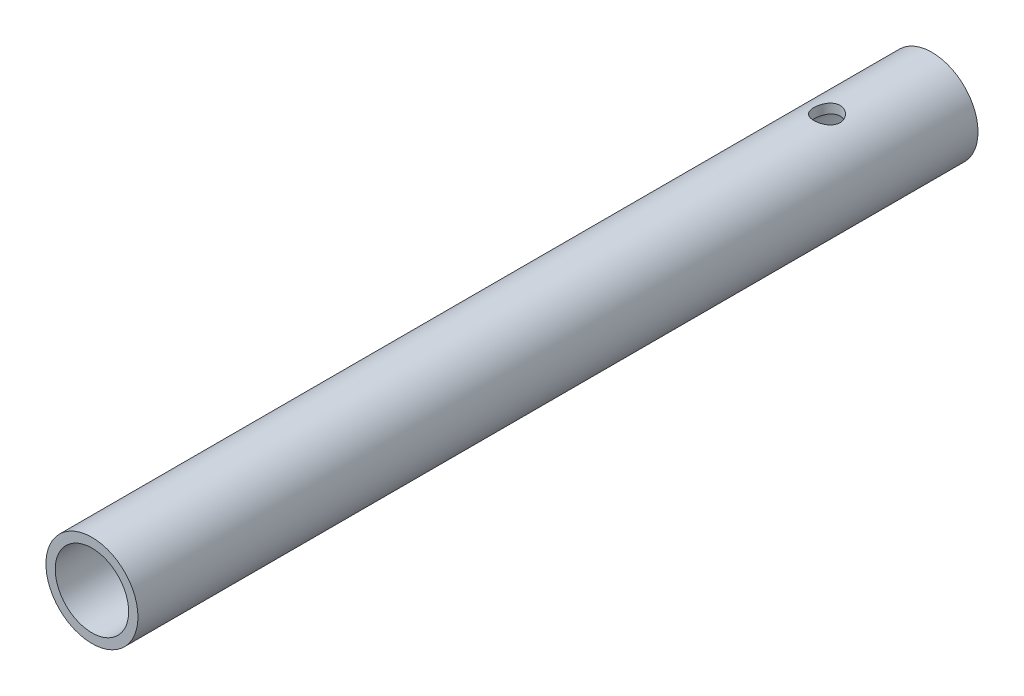
ISO-10303-21;
HEADER;
FILE_DESCRIPTION(('STEP AP214'),'2;1');
FILE_NAME('part.step','',(''),(''),'','','');
FILE_SCHEMA(('AUTOMOTIVE_DESIGN { 1 0 10303 214 1 1 1 1 }'));
ENDSEC;
DATA;
#1=APPLICATION_CONTEXT('core data for automotive mechanical design processes');
#2=APPLICATION_PROTOCOL_DEFINITION('international standard','automotive_design',2000,#1);
#3=PRODUCT_CONTEXT('',#1,'mechanical');
#4=PRODUCT('Part','Part','',(#3));
#5=PRODUCT_RELATED_PRODUCT_CATEGORY('part','',(#4));
#6=PRODUCT_DEFINITION_FORMATION('','',#4);
#7=PRODUCT_DEFINITION_CONTEXT('part definition',#1,'design');
#8=PRODUCT_DEFINITION('design','',#6,#7);
#9=PRODUCT_DEFINITION_SHAPE('','',#8);
#10=(LENGTH_UNIT() NAMED_UNIT(*) SI_UNIT(.MILLI.,.METRE.));
#11=(NAMED_UNIT(*) PLANE_ANGLE_UNIT() SI_UNIT($,.RADIAN.));
#12=(NAMED_UNIT(*) SI_UNIT($,.STERADIAN.) SOLID_ANGLE_UNIT());
#13=UNCERTAINTY_MEASURE_WITH_UNIT(LENGTH_MEASURE(1.E-05),#10,'distance_accuracy_value','');
#14=(GEOMETRIC_REPRESENTATION_CONTEXT(3) GLOBAL_UNCERTAINTY_ASSIGNED_CONTEXT((#13)) GLOBAL_UNIT_ASSIGNED_CONTEXT((#10,
#11,#12)) REPRESENTATION_CONTEXT('',''));
#15=CARTESIAN_POINT('',(0.,0.,0.));
#16=DIRECTION('',(0.,0.,1.));
#17=DIRECTION('',(1.,0.,0.));
#18=AXIS2_PLACEMENT_3D('',#15,#16,#17);
#19=CARTESIAN_POINT('',(0.,0.,152.4));
#20=DIRECTION('',(0.,0.,1.));
#21=DIRECTION('',(1.,0.,0.));
#22=AXIS2_PLACEMENT_3D('',#19,#20,#21);
#23=PLANE('',#22);
#24=CARTESIAN_POINT('',(0.,0.,152.4));
#25=DIRECTION('',(0.,0.,1.));
#26=DIRECTION('',(1.,0.,0.));
#27=AXIS2_PLACEMENT_3D('',#24,#25,#26);
#28=CIRCLE('',#27,16.7005);
#29=CARTESIAN_POINT('',(16.7005,0.,152.4));
#30=VERTEX_POINT('',#29);
#31=EDGE_CURVE('E10',#30,#30,#28,.T.);
#32=ORIENTED_EDGE('',*,*,#31,.T.);
#33=EDGE_LOOP('',(#32));
#34=FACE_BOUND('',#33,.T.);
#35=CARTESIAN_POINT('',(0.,0.,152.4));
#36=DIRECTION('',(0.,0.,1.));
#37=DIRECTION('',(1.,0.,0.));
#38=AXIS2_PLACEMENT_3D('',#35,#36,#37);
#39=CIRCLE('',#38,13.3223);
#40=CARTESIAN_POINT('',(13.3223,0.,152.4));
#41=VERTEX_POINT('',#40);
#42=EDGE_CURVE('E58',#41,#41,#39,.T.);
#43=ORIENTED_EDGE('',*,*,#42,.F.);
#44=EDGE_LOOP('',(#43));
#45=FACE_BOUND('',#44,.T.);
#46=ADVANCED_FACE('F37',(#34,#45),#23,.T.);
#47=CARTESIAN_POINT('',(0.,0.,-152.4));
#48=DIRECTION('',(0.,0.,1.));
#49=DIRECTION('',(1.,0.,0.));
#50=AXIS2_PLACEMENT_3D('',#47,#48,#49);
#51=PLANE('',#50);
#52=CARTESIAN_POINT('',(0.,0.,-152.4));
#53=DIRECTION('',(0.,0.,1.));
#54=DIRECTION('',(1.,0.,0.));
#55=AXIS2_PLACEMENT_3D('',#52,#53,#54);
#56=CIRCLE('',#55,16.7005);
#57=CARTESIAN_POINT('',(16.7005,0.,-152.4));
#58=VERTEX_POINT('',#57);
#59=EDGE_CURVE('E52',#58,#58,#56,.T.);
#60=ORIENTED_EDGE('',*,*,#59,.F.);
#61=EDGE_LOOP('',(#60));
#62=FACE_BOUND('',#61,.T.);
#63=CARTESIAN_POINT('',(0.,0.,-152.4));
#64=DIRECTION('',(0.,0.,1.));
#65=DIRECTION('',(1.,0.,0.));
#66=AXIS2_PLACEMENT_3D('',#63,#64,#65);
#67=CIRCLE('',#66,13.3223);
#68=CARTESIAN_POINT('',(13.3223,0.,-152.4));
#69=VERTEX_POINT('',#68);
#70=EDGE_CURVE('E61',#69,#69,#67,.T.);
#71=ORIENTED_EDGE('',*,*,#70,.T.);
#72=EDGE_LOOP('',(#71));
#73=FACE_BOUND('',#72,.T.);
#74=ADVANCED_FACE('F102',(#62,#73),#51,.F.);
#75=CARTESIAN_POINT('',(0.,0.,152.4));
#76=DIRECTION('',(0.,0.,-1.));
#77=DIRECTION('',(-1.,0.,0.));
#78=AXIS2_PLACEMENT_3D('',#75,#76,#77);
#79=CYLINDRICAL_SURFACE('',#78,16.7005);
#80=CARTESIAN_POINT('',(0.,-16.7005,-109.5375));
#81=CARTESIAN_POINT('',(0.261851066864258,-16.7004968587999,-109.537504669451));
#82=CARTESIAN_POINT('',(0.523750194040546,-16.6942818826769,-109.559167591413));
#83=CARTESIAN_POINT('',(1.03995906137509,-16.6700945455463,-109.645065361519));
#84=CARTESIAN_POINT('',(1.29426586807618,-16.6521177000182,-109.709316447637));
#85=CARTESIAN_POINT('',(1.78776754299851,-16.6063830335173,-109.878098176376));
#86=CARTESIAN_POINT('',(2.02698289826679,-16.5786388242701,-109.98257278267));
#87=CARTESIAN_POINT('',(2.484499437134,-16.5162751075854,-110.228616089177));
#88=CARTESIAN_POINT('',(2.70279845203344,-16.4816548883537,-110.370188630198));
#89=CARTESIAN_POINT('',(3.11800489491059,-16.4082383294875,-110.690321294058));
#90=CARTESIAN_POINT('',(3.31428654304814,-16.3693627672756,-110.869674856312));
#91=CARTESIAN_POINT('',(3.67443335557909,-16.2923058246313,-111.258585100789));
#92=CARTESIAN_POINT('',(3.83829368054584,-16.2541245486039,-111.468146283947));
#93=CARTESIAN_POINT('',(4.13212761208604,-16.1819540877822,-111.916680022377));
#94=CARTESIAN_POINT('',(4.26135761957093,-16.148064062663,-112.156157147302));
#95=CARTESIAN_POINT('',(4.47746373170107,-16.0894886123144,-112.654565031279));
#96=CARTESIAN_POINT('',(4.56434890892751,-16.0648012156447,-112.91349160946));
#97=CARTESIAN_POINT('',(4.69108050769783,-16.0282483121309,-113.43646394113));
#98=CARTESIAN_POINT('',(4.73207207374402,-16.0160713157122,-113.700209861798));
#99=CARTESIAN_POINT('',(4.76942629844259,-16.0049894048341,-114.231094619188));
#100=CARTESIAN_POINT('',(4.76579861364979,-16.0060816186347,-114.498232709272));
#101=CARTESIAN_POINT('',(4.71492117230756,-16.0211373963528,-115.019181547355));
#102=CARTESIAN_POINT('',(4.66908311676671,-16.034684393878,-115.273144162317));
#103=CARTESIAN_POINT('',(4.53735785275083,-16.0724525956833,-115.769614458079));
#104=CARTESIAN_POINT('',(4.4514670360329,-16.0966747616491,-116.012121104673));
#105=CARTESIAN_POINT('',(4.24098459970245,-16.1534118396287,-116.482351947684));
#106=CARTESIAN_POINT('',(4.11591830053792,-16.1860275388587,-116.709850992784));
#107=CARTESIAN_POINT('',(3.83096546767845,-16.2558256659924,-117.141116859733));
#108=CARTESIAN_POINT('',(3.6710712081389,-16.2930091063533,-117.344878400503));
#109=CARTESIAN_POINT('',(3.31389505645754,-16.3694630469047,-117.730919927017));
#110=CARTESIAN_POINT('',(3.11543505416256,-16.4087594970057,-117.912106474797));
#111=CARTESIAN_POINT('',(2.69046043751453,-16.4837682036742,-118.238867140561));
#112=CARTESIAN_POINT('',(2.46394438111898,-16.5194802758387,-118.384439426876));
#113=CARTESIAN_POINT('',(1.9874356690412,-16.5835712082356,-118.636418166407));
#114=CARTESIAN_POINT('',(1.73731961987351,-16.6119082412349,-118.742602618133));
#115=CARTESIAN_POINT('',(1.22178820758726,-16.6577548459264,-118.911087562533));
#116=CARTESIAN_POINT('',(0.956376703672368,-16.6752671358523,-118.97339907282));
#117=CARTESIAN_POINT('',(0.427100363082227,-16.6970697444338,-119.050596602478));
#118=CARTESIAN_POINT('',(0.163468681210381,-16.7017736415647,-119.066966611524));
#119=CARTESIAN_POINT('',(-0.362782020546788,-16.6986316733168,-119.055947816152));
#120=CARTESIAN_POINT('',(-0.625401157680415,-16.6907873075665,-119.028564240674));
#121=CARTESIAN_POINT('',(-1.13671046332572,-16.6636994629912,-118.932024112423));
#122=CARTESIAN_POINT('',(-1.3855743755721,-16.6446878329108,-118.863716639744));
#123=CARTESIAN_POINT('',(-1.86827071984482,-16.5974434633317,-118.688272921255));
#124=CARTESIAN_POINT('',(-2.10210141270511,-16.5692096592254,-118.581132192377));
#125=CARTESIAN_POINT('',(-2.55369492229686,-16.5057111617355,-118.328453616335));
#126=CARTESIAN_POINT('',(-2.77100183278505,-16.4703078307465,-118.182136709282));
#127=CARTESIAN_POINT('',(-3.17849132760995,-16.3965498251763,-117.856220377323));
#128=CARTESIAN_POINT('',(-3.36866774802171,-16.358194482949,-117.676613410311));
#129=CARTESIAN_POINT('',(-3.72290658808979,-16.2812971161416,-117.282259873408));
#130=CARTESIAN_POINT('',(-3.88591652517519,-16.2427897114313,-117.066559207075));
#131=CARTESIAN_POINT('',(-4.17347667245696,-16.1712964596139,-116.610034758073));
#132=CARTESIAN_POINT('',(-4.29802823091364,-16.1383104189592,-116.369211856527));
#133=CARTESIAN_POINT('',(-4.5042264953334,-16.0819799623853,-115.870285238541));
#134=CARTESIAN_POINT('',(-4.58610140418978,-16.0585844103618,-115.612281931997));
#135=CARTESIAN_POINT('',(-4.70504863839723,-16.0241419675628,-115.08537292872));
#136=CARTESIAN_POINT('',(-4.7421344750013,-16.0130913528389,-114.816470545157));
#137=CARTESIAN_POINT('',(-4.76959478743295,-16.0049318418651,-114.286255294797));
#138=CARTESIAN_POINT('',(-4.76167339081926,-16.0073142969749,-114.025037286253));
#139=CARTESIAN_POINT('',(-4.70335931720767,-16.024544169828,-113.507825967019));
#140=CARTESIAN_POINT('',(-4.65296804735032,-16.0393911745874,-113.251832483515));
#141=CARTESIAN_POINT('',(-4.51219538927524,-16.0795531125714,-112.754827868809));
#142=CARTESIAN_POINT('',(-4.42222391359401,-16.1047605762253,-112.513691321255));
#143=CARTESIAN_POINT('',(-4.2051618774969,-16.162793025589,-112.049745856025));
#144=CARTESIAN_POINT('',(-4.07806476855709,-16.195619354967,-111.826940180593));
#145=CARTESIAN_POINT('',(-3.78540069676853,-16.2665545086903,-111.397968382483));
#146=CARTESIAN_POINT('',(-3.61869450490773,-16.3048027484626,-111.192602500565));
#147=CARTESIAN_POINT('',(-3.2536479272947,-16.3815508331911,-110.812207244124));
#148=CARTESIAN_POINT('',(-3.05529959559921,-16.4200507390104,-110.637185512693));
#149=CARTESIAN_POINT('',(-2.62649521887826,-16.4941412662119,-110.318020351858));
#150=CARTESIAN_POINT('',(-2.39534885378574,-16.529632544499,-110.174779121722));
#151=CARTESIAN_POINT('',(-1.9112434928618,-16.5925664100406,-109.929404999612));
#152=CARTESIAN_POINT('',(-1.65829657197492,-16.6200134162703,-109.827249526395));
#153=CARTESIAN_POINT('',(-1.17245500201873,-16.6608343143779,-109.678039720005));
#154=CARTESIAN_POINT('',(-0.941356793742052,-16.6755928418338,-109.625470472473));
#155=CARTESIAN_POINT('',(-0.473518321010904,-16.695426462607,-109.555200813972));
#156=CARTESIAN_POINT('',(-0.236778809193571,-16.70050284043,-109.53749577765));
#157=CARTESIAN_POINT('',(0.,-16.7005,-109.5375));
#158=B_SPLINE_CURVE_WITH_KNOTS('',3,(#80,#81,#82,#83,#84,#85,#86,#87,#88,#89,#90,#91,#92,#93,
#94,#95,#96,#97,#98,#99,#100,#101,#102,#103,#104,#105,#106,#107,#108,#109,#110,#111,#112,#113,
#114,#115,#116,#117,#118,#119,#120,#121,#122,#123,#124,#125,#126,#127,#128,#129,#130,#131,#132,
#133,#134,#135,#136,#137,#138,#139,#140,#141,#142,#143,#144,#145,#146,#147,#148,#149,#150,#151,
#152,#153,#154,#155,#156,#157),.UNSPECIFIED.,.T.,.F.,(4,2,2,2,2,2,2,2,2,2,2,2,2,2,2,2,2,2,2,2,2,
2,2,2,2,2,2,2,2,2,2,2,2,2,2,2,2,2,4),(0.,0.784684112948681,1.56966758174014,2.35356140576426,
3.13753641964346,3.93999727705401,4.7425778250018,5.56121634603525,6.37967939268171,
7.17723026359318,7.97460853057191,8.74625105450002,9.51796310701064,10.2994132101758,
11.0810368383388,11.8919998358795,12.703004533111,13.5185132321812,14.3338170631308,
15.1224641225005,15.911016938612,16.6837496393228,17.4565715758185,18.2460789074958,
19.0357653269846,19.8511761296792,20.6665583427419,21.4775345760985,22.288266105923,
23.0685102380001,23.8487285195174,24.6210500075374,25.3935078063076,26.191665787193,
26.9900245171572,27.8087613429932,28.6270475639417,29.3366922723599,30.0462428274983),.UNSPECIFIED.);
#159=CARTESIAN_POINT('',(0.,-16.7005,-109.5375));
#160=VERTEX_POINT('',#159);
#161=EDGE_CURVE('E88',#160,#160,#158,.T.);
#162=ORIENTED_EDGE('',*,*,#161,.T.);
#163=EDGE_LOOP('',(#162));
#164=FACE_BOUND('',#163,.T.);
#165=CARTESIAN_POINT('',(0.,16.7005,-109.5375));
#166=CARTESIAN_POINT('',(-0.261851066864258,16.7004968587999,-109.537504669451));
#167=CARTESIAN_POINT('',(-0.523750194040546,16.6942818826769,-109.559167591413));
#168=CARTESIAN_POINT('',(-1.03995906137509,16.6700945455463,-109.645065361519));
#169=CARTESIAN_POINT('',(-1.29426586807618,16.6521177000182,-109.709316447637));
#170=CARTESIAN_POINT('',(-1.78776754299851,16.6063830335173,-109.878098176376));
#171=CARTESIAN_POINT('',(-2.02698289826679,16.5786388242701,-109.98257278267));
#172=CARTESIAN_POINT('',(-2.484499437134,16.5162751075854,-110.228616089177));
#173=CARTESIAN_POINT('',(-2.70279845203344,16.4816548883537,-110.370188630198));
#174=CARTESIAN_POINT('',(-3.11800489491059,16.4082383294875,-110.690321294058));
#175=CARTESIAN_POINT('',(-3.31428654304814,16.3693627672756,-110.869674856312));
#176=CARTESIAN_POINT('',(-3.67443335557909,16.2923058246313,-111.258585100789));
#177=CARTESIAN_POINT('',(-3.83829368054584,16.2541245486039,-111.468146283947));
#178=CARTESIAN_POINT('',(-4.13212761208604,16.1819540877822,-111.916680022377));
#179=CARTESIAN_POINT('',(-4.26135761957093,16.148064062663,-112.156157147302));
#180=CARTESIAN_POINT('',(-4.47746373170107,16.0894886123144,-112.654565031279));
#181=CARTESIAN_POINT('',(-4.56434890892751,16.0648012156447,-112.91349160946));
#182=CARTESIAN_POINT('',(-4.69108050769783,16.0282483121309,-113.43646394113));
#183=CARTESIAN_POINT('',(-4.73207207374402,16.0160713157122,-113.700209861798));
#184=CARTESIAN_POINT('',(-4.76942629844259,16.0049894048341,-114.231094619188));
#185=CARTESIAN_POINT('',(-4.76579861364979,16.0060816186347,-114.498232709272));
#186=CARTESIAN_POINT('',(-4.71492117230756,16.0211373963528,-115.019181547355));
#187=CARTESIAN_POINT('',(-4.66908311676671,16.034684393878,-115.273144162317));
#188=CARTESIAN_POINT('',(-4.53735785275083,16.0724525956833,-115.769614458079));
#189=CARTESIAN_POINT('',(-4.4514670360329,16.0966747616491,-116.012121104673));
#190=CARTESIAN_POINT('',(-4.24098459970245,16.1534118396287,-116.482351947684));
#191=CARTESIAN_POINT('',(-4.11591830053792,16.1860275388587,-116.709850992784));
#192=CARTESIAN_POINT('',(-3.83096546767845,16.2558256659924,-117.141116859733));
#193=CARTESIAN_POINT('',(-3.6710712081389,16.2930091063533,-117.344878400503));
#194=CARTESIAN_POINT('',(-3.31389505645754,16.3694630469047,-117.730919927017));
#195=CARTESIAN_POINT('',(-3.11543505416256,16.4087594970057,-117.912106474797));
#196=CARTESIAN_POINT('',(-2.69046043751453,16.4837682036742,-118.238867140561));
#197=CARTESIAN_POINT('',(-2.46394438111898,16.5194802758387,-118.384439426876));
#198=CARTESIAN_POINT('',(-1.9874356690412,16.5835712082356,-118.636418166407));
#199=CARTESIAN_POINT('',(-1.73731961987351,16.6119082412349,-118.742602618133));
#200=CARTESIAN_POINT('',(-1.22178820758726,16.6577548459264,-118.911087562533));
#201=CARTESIAN_POINT('',(-0.956376703672368,16.6752671358523,-118.97339907282));
#202=CARTESIAN_POINT('',(-0.427100363082227,16.6970697444338,-119.050596602478));
#203=CARTESIAN_POINT('',(-0.163468681210381,16.7017736415647,-119.066966611524));
#204=CARTESIAN_POINT('',(0.362782020546788,16.6986316733168,-119.055947816152));
#205=CARTESIAN_POINT('',(0.625401157680415,16.6907873075665,-119.028564240674));
#206=CARTESIAN_POINT('',(1.13671046332572,16.6636994629912,-118.932024112423));
#207=CARTESIAN_POINT('',(1.3855743755721,16.6446878329108,-118.863716639744));
#208=CARTESIAN_POINT('',(1.86827071984482,16.5974434633317,-118.688272921255));
#209=CARTESIAN_POINT('',(2.10210141270511,16.5692096592254,-118.581132192377));
#210=CARTESIAN_POINT('',(2.55369492229686,16.5057111617355,-118.328453616335));
#211=CARTESIAN_POINT('',(2.77100183278505,16.4703078307465,-118.182136709282));
#212=CARTESIAN_POINT('',(3.17849132760995,16.3965498251763,-117.856220377323));
#213=CARTESIAN_POINT('',(3.36866774802171,16.358194482949,-117.676613410311));
#214=CARTESIAN_POINT('',(3.72290658808979,16.2812971161416,-117.282259873408));
#215=CARTESIAN_POINT('',(3.88591652517519,16.2427897114313,-117.066559207075));
#216=CARTESIAN_POINT('',(4.17347667245696,16.1712964596139,-116.610034758073));
#217=CARTESIAN_POINT('',(4.29802823091364,16.1383104189592,-116.369211856527));
#218=CARTESIAN_POINT('',(4.5042264953334,16.0819799623853,-115.870285238541));
#219=CARTESIAN_POINT('',(4.58610140418978,16.0585844103618,-115.612281931997));
#220=CARTESIAN_POINT('',(4.70504863839723,16.0241419675628,-115.08537292872));
#221=CARTESIAN_POINT('',(4.7421344750013,16.0130913528389,-114.816470545157));
#222=CARTESIAN_POINT('',(4.76959478743295,16.0049318418651,-114.286255294797));
#223=CARTESIAN_POINT('',(4.76167339081926,16.0073142969749,-114.025037286253));
#224=CARTESIAN_POINT('',(4.70335931720767,16.024544169828,-113.507825967019));
#225=CARTESIAN_POINT('',(4.65296804735032,16.0393911745874,-113.251832483515));
#226=CARTESIAN_POINT('',(4.51219538927524,16.0795531125714,-112.754827868809));
#227=CARTESIAN_POINT('',(4.42222391359401,16.1047605762253,-112.513691321255));
#228=CARTESIAN_POINT('',(4.2051618774969,16.162793025589,-112.049745856025));
#229=CARTESIAN_POINT('',(4.07806476855709,16.195619354967,-111.826940180593));
#230=CARTESIAN_POINT('',(3.78540069676853,16.2665545086903,-111.397968382483));
#231=CARTESIAN_POINT('',(3.61869450490773,16.3048027484626,-111.192602500565));
#232=CARTESIAN_POINT('',(3.2536479272947,16.3815508331911,-110.812207244124));
#233=CARTESIAN_POINT('',(3.05529959559921,16.4200507390104,-110.637185512693));
#234=CARTESIAN_POINT('',(2.62649521887826,16.4941412662119,-110.318020351858));
#235=CARTESIAN_POINT('',(2.39534885378574,16.529632544499,-110.174779121722));
#236=CARTESIAN_POINT('',(1.9112434928618,16.5925664100406,-109.929404999612));
#237=CARTESIAN_POINT('',(1.65829657197492,16.6200134162703,-109.827249526395));
#238=CARTESIAN_POINT('',(1.17245500201873,16.6608343143779,-109.678039720005));
#239=CARTESIAN_POINT('',(0.941356793742052,16.6755928418338,-109.625470472473));
#240=CARTESIAN_POINT('',(0.473518321010904,16.695426462607,-109.555200813972));
#241=CARTESIAN_POINT('',(0.236778809193571,16.70050284043,-109.53749577765));
#242=CARTESIAN_POINT('',(0.,16.7005,-109.5375));
#243=B_SPLINE_CURVE_WITH_KNOTS('',3,(#165,#166,#167,#168,#169,#170,#171,#172,#173,#174,#175,
#176,#177,#178,#179,#180,#181,#182,#183,#184,#185,#186,#187,#188,#189,#190,#191,#192,#193,#194,
#195,#196,#197,#198,#199,#200,#201,#202,#203,#204,#205,#206,#207,#208,#209,#210,#211,#212,#213,
#214,#215,#216,#217,#218,#219,#220,#221,#222,#223,#224,#225,#226,#227,#228,#229,#230,#231,#232,
#233,#234,#235,#236,#237,#238,#239,#240,#241,#242),.UNSPECIFIED.,.T.,.F.,(4,2,2,2,2,2,2,2,2,2,2,
2,2,2,2,2,2,2,2,2,2,2,2,2,2,2,2,2,2,2,2,2,2,2,2,2,2,2,4),(0.,0.784684112948681,1.56966758174014,
2.35356140576426,3.13753641964346,3.93999727705401,4.7425778250018,5.56121634603525,
6.37967939268171,7.17723026359318,7.97460853057191,8.74625105450002,9.51796310701064,
10.2994132101758,11.0810368383388,11.8919998358795,12.703004533111,13.5185132321812,
14.3338170631308,15.1224641225005,15.911016938612,16.6837496393228,17.4565715758185,
18.2460789074958,19.0357653269846,19.8511761296792,20.6665583427419,21.4775345760985,
22.288266105923,23.0685102380001,23.8487285195174,24.6210500075374,25.3935078063076,
26.191665787193,26.9900245171572,27.8087613429932,28.6270475639417,29.3366922723599,
30.0462428274983),.UNSPECIFIED.);
#244=CARTESIAN_POINT('',(0.,16.7005,-109.5375));
#245=VERTEX_POINT('',#244);
#246=EDGE_CURVE('E82',#245,#245,#243,.T.);
#247=ORIENTED_EDGE('',*,*,#246,.T.);
#248=EDGE_LOOP('',(#247));
#249=FACE_BOUND('',#248,.T.);
#250=ORIENTED_EDGE('',*,*,#31,.F.);
#251=EDGE_LOOP('',(#250));
#252=FACE_BOUND('',#251,.T.);
#253=ORIENTED_EDGE('',*,*,#59,.T.);
#254=EDGE_LOOP('',(#253));
#255=FACE_BOUND('',#254,.T.);
#256=ADVANCED_FACE('F39',(#164,#249,#252,#255),#79,.T.);
#257=CARTESIAN_POINT('',(0.,0.,152.4));
#258=DIRECTION('',(0.,0.,-1.));
#259=DIRECTION('',(-1.,0.,0.));
#260=AXIS2_PLACEMENT_3D('',#257,#258,#259);
#261=CYLINDRICAL_SURFACE('',#260,13.3223);
#262=CARTESIAN_POINT('',(0.,-13.3223,-109.5375));
#263=CARTESIAN_POINT('',(0.129350730515938,-13.322300243397,-109.537499660995));
#264=CARTESIAN_POINT('',(0.258696460501115,-13.3204119620705,-109.542773925758));
#265=CARTESIAN_POINT('',(0.516467405969376,-13.3129098386555,-109.563820679898));
#266=CARTESIAN_POINT('',(0.6448922951605,-13.3072947361351,-109.579596721041));
#267=CARTESIAN_POINT('',(0.899775556580223,-13.2924930523825,-109.621487052547));
#268=CARTESIAN_POINT('',(1.02623475763142,-13.2833080213503,-109.647596855683));
#269=CARTESIAN_POINT('',(1.27639402660263,-13.2616088149797,-109.709918322214));
#270=CARTESIAN_POINT('',(1.40009300507459,-13.249093349471,-109.746133900729));
#271=CARTESIAN_POINT('',(1.64357756681572,-13.2210932519869,-109.828252847969));
#272=CARTESIAN_POINT('',(1.76337130678933,-13.2056153439842,-109.87413430098));
#273=CARTESIAN_POINT('',(1.99858479314219,-13.1720721112586,-109.97524793107));
#274=CARTESIAN_POINT('',(2.11400289974136,-13.154005828423,-110.030483572079));
#275=CARTESIAN_POINT('',(2.45257279332757,-13.0965942379668,-110.209601902114));
#276=CARTESIAN_POINT('',(2.66823564493485,-13.0540126109617,-110.346962375865));
#277=CARTESIAN_POINT('',(3.08134768244231,-12.9628485660007,-110.659092223306));
#278=CARTESIAN_POINT('',(3.27788606825518,-12.9141074592993,-110.835010240137));
#279=CARTESIAN_POINT('',(3.63948619846007,-12.816898546946,-111.217044596596));
#280=CARTESIAN_POINT('',(3.80453954158871,-12.7684308175789,-111.42316897042));
#281=CARTESIAN_POINT('',(4.02766769618274,-12.6991313559906,-111.754820414924));
#282=CARTESIAN_POINT('',(4.09893749715702,-12.6762476387662,-111.87125610319));
#283=CARTESIAN_POINT('',(4.23136250269145,-12.6326601029583,-112.110115644299));
#284=CARTESIAN_POINT('',(4.29252173533412,-12.611955417442,-112.232537087089));
#285=CARTESIAN_POINT('',(4.40421989187281,-12.5733854444767,-112.482580665879));
#286=CARTESIAN_POINT('',(4.45475729264168,-12.5555205643335,-112.610203544616));
#287=CARTESIAN_POINT('',(4.54471312986649,-12.5232401960634,-112.869675123864));
#288=CARTESIAN_POINT('',(4.58413679833238,-12.5088230853171,-113.001521803272));
#289=CARTESIAN_POINT('',(4.65022326269924,-12.4844021000019,-113.263473734426));
#290=CARTESIAN_POINT('',(4.6773093986414,-12.4742529192449,-113.393458675081));
#291=CARTESIAN_POINT('',(4.72054562953798,-12.4579557681722,-113.655430150868));
#292=CARTESIAN_POINT('',(4.73670040803317,-12.4518060843158,-113.787415803981));
#293=CARTESIAN_POINT('',(4.75791541644593,-12.4437151897086,-114.05238991446));
#294=CARTESIAN_POINT('',(4.76297690258746,-12.4417735024373,-114.185378256568));
#295=CARTESIAN_POINT('',(4.76195246579,-12.4421656891435,-114.451303176176));
#296=CARTESIAN_POINT('',(4.75586692183525,-12.4444994177626,-114.584239755284));
#297=CARTESIAN_POINT('',(4.73324437616506,-12.4531204846095,-114.841861180851));
#298=CARTESIAN_POINT('',(4.71728786627513,-12.4591881407542,-114.966604872156));
#299=CARTESIAN_POINT('',(4.67560760469911,-12.4748894205744,-115.214261875677));
#300=CARTESIAN_POINT('',(4.64988058973155,-12.4845242356296,-115.337174562079));
#301=CARTESIAN_POINT('',(4.58889931790374,-12.5070674499487,-115.580274643974));
#302=CARTESIAN_POINT('',(4.55364762410673,-12.5199749684804,-115.700462763222));
#303=CARTESIAN_POINT('',(4.47392205406653,-12.5486846459054,-115.937400091566));
#304=CARTESIAN_POINT('',(4.42944465003211,-12.5644879118245,-116.054147965596));
#305=CARTESIAN_POINT('',(4.28096362052221,-12.6161876622691,-116.402134851126));
#306=CARTESIAN_POINT('',(4.16294593080656,-12.6559710636699,-116.627003440079));
#307=CARTESIAN_POINT('',(3.89346586061366,-12.7414488479612,-117.054320613302));
#308=CARTESIAN_POINT('',(3.74199270994864,-12.787145132397,-117.256761946066));
#309=CARTESIAN_POINT('',(3.3990225300915,-12.8826953987448,-117.646550860601));
#310=CARTESIAN_POINT('',(3.20565566225802,-12.9326334820895,-117.83223912407));
#311=CARTESIAN_POINT('',(2.78993599174279,-13.0286374780387,-118.169011157046));
#312=CARTESIAN_POINT('',(2.56757951608161,-13.0747028987587,-118.320090534913));
#313=CARTESIAN_POINT('',(2.09626212291889,-13.1585450435471,-118.58498123236));
#314=CARTESIAN_POINT('',(1.84699489471295,-13.1962071251106,-118.698286424519));
#315=CARTESIAN_POINT('',(1.33126128643145,-13.2581572961857,-118.880817801618));
#316=CARTESIAN_POINT('',(1.06480186749922,-13.2824507611718,-118.950061705205));
#317=CARTESIAN_POINT('',(0.536266189021672,-13.314005100732,-119.039421011495));
#318=CARTESIAN_POINT('',(0.274614639359339,-13.3220420518479,-119.061776901903));
#319=CARTESIAN_POINT('',(-0.248791544331392,-13.3225454350244,-119.063188094349));
#320=CARTESIAN_POINT('',(-0.51054614765918,-13.3150149521512,-119.042251975751));
#321=CARTESIAN_POINT('',(-1.01735773250936,-13.2857423858395,-118.959408082939));
#322=CARTESIAN_POINT('',(-1.26267956379922,-13.2644957550019,-118.898927777461));
#323=CARTESIAN_POINT('',(-1.73955366796628,-13.210422654735,-118.740553437206));
#324=CARTESIAN_POINT('',(-1.97110414828661,-13.177594681651,-118.642654544076));
#325=CARTESIAN_POINT('',(-2.42117744757249,-13.1024854927309,-118.409181771086));
#326=CARTESIAN_POINT('',(-2.63914788270048,-13.0599635494472,-118.272622243269));
#327=CARTESIAN_POINT('',(-3.04975895363681,-12.9702313831047,-117.966878006562));
#328=CARTESIAN_POINT('',(-3.24239084812593,-12.9230195519303,-117.797682088122));
#329=CARTESIAN_POINT('',(-3.60752375423629,-12.826028490505,-117.420811961203));
#330=CARTESIAN_POINT('',(-3.77843324232411,-12.7762448194416,-117.211582086642));
#331=CARTESIAN_POINT('',(-4.00672354202706,-12.7057552356883,-116.877948385758));
#332=CARTESIAN_POINT('',(-4.07817491003337,-12.6829442364463,-116.763366123677));
#333=CARTESIAN_POINT('',(-4.21122984275327,-12.6393873704902,-116.528264069439));
#334=CARTESIAN_POINT('',(-4.27283754830913,-12.6186406368136,-116.407746801964));
#335=CARTESIAN_POINT('',(-4.38579506308812,-12.5798273818709,-116.161347096193));
#336=CARTESIAN_POINT('',(-4.43712823627972,-12.5617652193114,-116.035456350872));
#337=CARTESIAN_POINT('',(-4.52893413088816,-12.5289588593337,-115.779407664143));
#338=CARTESIAN_POINT('',(-4.56941140439637,-12.5142132716307,-115.649251537068));
#339=CARTESIAN_POINT('',(-4.63911785502316,-12.4885405374433,-115.385622972923));
#340=CARTESIAN_POINT('',(-4.66834975340275,-12.4776124672193,-115.252151346502));
#341=CARTESIAN_POINT('',(-4.71526174502259,-12.4599604782178,-114.982920592903));
#342=CARTESIAN_POINT('',(-4.73294254328319,-12.453236302857,-114.847161605852));
#343=CARTESIAN_POINT('',(-4.75585628605772,-12.4445026869162,-114.582529082299));
#344=CARTESIAN_POINT('',(-4.76176198311787,-12.442238530753,-114.45372177199));
#345=CARTESIAN_POINT('',(-4.76310824686383,-12.441723297448,-114.195998476661));
#346=CARTESIAN_POINT('',(-4.75854527246796,-12.4434735782098,-114.067082469617));
#347=CARTESIAN_POINT('',(-4.7389982168454,-12.4509309503096,-113.810219341814));
#348=CARTESIAN_POINT('',(-4.72401887614534,-12.4566362417039,-113.682271807066));
#349=CARTESIAN_POINT('',(-4.68379066196936,-12.4718179594421,-113.428183061451));
#350=CARTESIAN_POINT('',(-4.65853792516311,-12.4812958044331,-113.302042548612));
#351=CARTESIAN_POINT('',(-4.59877982209245,-12.5034350935499,-113.05570318004));
#352=CARTESIAN_POINT('',(-4.56452810551835,-12.5160087451646,-112.935434896797));
#353=CARTESIAN_POINT('',(-4.48680413205207,-12.5440809171326,-112.698252621135));
#354=CARTESIAN_POINT('',(-4.44332862628687,-12.5595804678556,-112.581339827129));
#355=CARTESIAN_POINT('',(-4.29956467893296,-12.6098285384576,-112.236756039018));
#356=CARTESIAN_POINT('',(-4.18589270689911,-12.6483444536434,-112.015051247642));
#357=CARTESIAN_POINT('',(-3.91982730861761,-12.7333822711104,-111.582640620216));
#358=CARTESIAN_POINT('',(-3.76581493822218,-12.7802031483946,-111.372999557292));
#359=CARTESIAN_POINT('',(-3.42585695171425,-12.8754894853158,-110.981563679174));
#360=CARTESIAN_POINT('',(-3.23990167004999,-12.9239554391615,-110.799777324083));
#361=CARTESIAN_POINT('',(-2.93574837547195,-12.9952550432699,-110.547492705599));
#362=CARTESIAN_POINT('',(-2.82740487428935,-13.0193133328222,-110.465195023847));
#363=CARTESIAN_POINT('',(-2.60385761598932,-13.0658567248872,-110.310035792277));
#364=CARTESIAN_POINT('',(-2.48865642075261,-13.0883424081471,-110.237170750532));
#365=CARTESIAN_POINT('',(-2.25207894915534,-13.1311186336235,-110.101409688564));
#366=CARTESIAN_POINT('',(-2.13070032122787,-13.1514083305632,-110.038517502779));
#367=CARTESIAN_POINT('',(-1.88267410748747,-13.1891978671372,-109.923285306735));
#368=CARTESIAN_POINT('',(-1.75602884488528,-13.2066989207732,-109.870940702074));
#369=CARTESIAN_POINT('',(-1.49762759306552,-13.2384977964792,-109.777001136145));
#370=CARTESIAN_POINT('',(-1.36584759821901,-13.2527777194248,-109.735466053994));
#371=CARTESIAN_POINT('',(-1.09889777659129,-13.2775773366837,-109.663954874989));
#372=CARTESIAN_POINT('',(-0.963729414538605,-13.2880986267794,-109.633973872256));
#373=CARTESIAN_POINT('',(-0.691059293129309,-13.3050655984981,-109.585871580246));
#374=CARTESIAN_POINT('',(-0.553557791663836,-13.31151172759,-109.56774898886));
#375=CARTESIAN_POINT('',(-0.277368894654891,-13.3201286650425,-109.543563755133));
#376=CARTESIAN_POINT('',(-0.138681573333452,-13.3222997390453,-109.537500363459));
#377=CARTESIAN_POINT('',(0.,-13.3223,-109.5375));
#378=B_SPLINE_CURVE_WITH_KNOTS('',3,(#262,#263,#264,#265,#266,#267,#268,#269,#270,#271,#272,
#273,#274,#275,#276,#277,#278,#279,#280,#281,#282,#283,#284,#285,#286,#287,#288,#289,#290,#291,
#292,#293,#294,#295,#296,#297,#298,#299,#300,#301,#302,#303,#304,#305,#306,#307,#308,#309,#310,
#311,#312,#313,#314,#315,#316,#317,#318,#319,#320,#321,#322,#323,#324,#325,#326,#327,#328,#329,
#330,#331,#332,#333,#334,#335,#336,#337,#338,#339,#340,#341,#342,#343,#344,#345,#346,#347,#348,
#349,#350,#351,#352,#353,#354,#355,#356,#357,#358,#359,#360,#361,#362,#363,#364,#365,#366,#367,
#368,#369,#370,#371,#372,#373,#374,#375,#376,#377),.UNSPECIFIED.,.T.,.F.,(4,2,2,2,2,2,2,2,2,2,2,
2,2,2,2,2,2,2,2,2,2,2,2,2,2,2,2,2,2,2,2,2,2,2,2,2,2,2,2,2,2,2,2,2,2,2,2,2,2,2,2,2,2,2,2,2,2,4),
(0.,0.387922860761339,0.775976986107835,1.16386279138639,1.55189907826425,1.93906485016833,
2.3263743074126,3.10037724336654,3.90168216543757,4.7032006043116,5.11803694927494,
5.53270762173076,5.94743771575411,6.36197224006306,6.76095128124039,7.15975927140217,
7.55852209751109,7.95727136646462,8.33454677283031,8.71194829756116,9.08924836561789,
9.4666929751511,10.2342147174608,11.001983906168,11.8163031435233,12.6307256554652,
13.4556587354044,14.2802598697713,15.0644663415829,15.8485174186789,16.6057215845295,
17.3630240976081,18.1417076618381,18.9206591566125,19.7405771917999,20.151017021355,
20.5612837378264,20.972209458366,21.3829625993422,21.7936162798139,22.2042448937328,
22.590651332125,22.9771884937414,23.3635498559056,23.7500566445027,24.1266603294895,
24.5033968855648,25.2562924494245,26.0459304113392,26.8358077307247,27.2498916973321,
27.6638219306082,28.0779109310333,28.4918191674286,28.9079736520875,29.3239512417144,
29.7398831474045,30.1557892072142),.UNSPECIFIED.);
#379=CARTESIAN_POINT('',(0.,-13.3223,-109.5375));
#380=VERTEX_POINT('',#379);
#381=EDGE_CURVE('E42',#380,#380,#378,.T.);
#382=ORIENTED_EDGE('',*,*,#381,.F.);
#383=EDGE_LOOP('',(#382));
#384=FACE_BOUND('',#383,.T.);
#385=CARTESIAN_POINT('',(0.,13.3223,-109.5375));
#386=CARTESIAN_POINT('',(-0.129350730515938,13.322300243397,-109.537499660995));
#387=CARTESIAN_POINT('',(-0.258696460501114,13.3204119620705,-109.542773925758));
#388=CARTESIAN_POINT('',(-0.516467405969375,13.3129098386555,-109.563820679898));
#389=CARTESIAN_POINT('',(-0.6448922951605,13.3072947361351,-109.579596721041));
#390=CARTESIAN_POINT('',(-0.899775556580223,13.2924930523825,-109.621487052547));
#391=CARTESIAN_POINT('',(-1.02623475763142,13.2833080213503,-109.647596855683));
#392=CARTESIAN_POINT('',(-1.27639402660263,13.2616088149797,-109.709918322214));
#393=CARTESIAN_POINT('',(-1.40009300507459,13.249093349471,-109.746133900729));
#394=CARTESIAN_POINT('',(-1.64357756681572,13.2210932519869,-109.828252847969));
#395=CARTESIAN_POINT('',(-1.76337130678934,13.2056153439842,-109.87413430098));
#396=CARTESIAN_POINT('',(-1.99858479314219,13.1720721112586,-109.97524793107));
#397=CARTESIAN_POINT('',(-2.11400289974136,13.154005828423,-110.030483572079));
#398=CARTESIAN_POINT('',(-2.45257279332757,13.0965942379668,-110.209601902114));
#399=CARTESIAN_POINT('',(-2.66823564493485,13.0540126109617,-110.346962375865));
#400=CARTESIAN_POINT('',(-3.0813476824423,12.9628485660007,-110.659092223306));
#401=CARTESIAN_POINT('',(-3.27788606825518,12.9141074592993,-110.835010240137));
#402=CARTESIAN_POINT('',(-3.63948619846007,12.816898546946,-111.217044596596));
#403=CARTESIAN_POINT('',(-3.80453954158872,12.7684308175789,-111.42316897042));
#404=CARTESIAN_POINT('',(-4.02766769618273,12.6991313559906,-111.754820414924));
#405=CARTESIAN_POINT('',(-4.09893749715701,12.6762476387662,-111.87125610319));
#406=CARTESIAN_POINT('',(-4.23136250269144,12.6326601029583,-112.110115644299));
#407=CARTESIAN_POINT('',(-4.29252173533411,12.611955417442,-112.232537087089));
#408=CARTESIAN_POINT('',(-4.40421989187281,12.5733854444767,-112.482580665879));
#409=CARTESIAN_POINT('',(-4.45475729264168,12.5555205643335,-112.610203544616));
#410=CARTESIAN_POINT('',(-4.54471312986649,12.5232401960634,-112.869675123864));
#411=CARTESIAN_POINT('',(-4.58413679833238,12.5088230853171,-113.001521803272));
#412=CARTESIAN_POINT('',(-4.65022326269924,12.4844021000019,-113.263473734426));
#413=CARTESIAN_POINT('',(-4.67730939864139,12.4742529192449,-113.393458675081));
#414=CARTESIAN_POINT('',(-4.72054562953798,12.4579557681722,-113.655430150868));
#415=CARTESIAN_POINT('',(-4.73670040803317,12.4518060843158,-113.787415803981));
#416=CARTESIAN_POINT('',(-4.75791541644593,12.4437151897086,-114.05238991446));
#417=CARTESIAN_POINT('',(-4.76297690258746,12.4417735024373,-114.185378256568));
#418=CARTESIAN_POINT('',(-4.76195246579,12.4421656891435,-114.451303176176));
#419=CARTESIAN_POINT('',(-4.75586692183525,12.4444994177626,-114.584239755284));
#420=CARTESIAN_POINT('',(-4.73324437616506,12.4531204846095,-114.841861180851));
#421=CARTESIAN_POINT('',(-4.71728786627513,12.4591881407542,-114.966604872156));
#422=CARTESIAN_POINT('',(-4.67560760469911,12.4748894205744,-115.214261875677));
#423=CARTESIAN_POINT('',(-4.64988058973155,12.4845242356296,-115.337174562079));
#424=CARTESIAN_POINT('',(-4.58889931790374,12.5070674499487,-115.580274643974));
#425=CARTESIAN_POINT('',(-4.55364762410673,12.5199749684804,-115.700462763222));
#426=CARTESIAN_POINT('',(-4.47392205406653,12.5486846459054,-115.937400091566));
#427=CARTESIAN_POINT('',(-4.42944465003211,12.5644879118245,-116.054147965596));
#428=CARTESIAN_POINT('',(-4.28096362052221,12.6161876622691,-116.402134851126));
#429=CARTESIAN_POINT('',(-4.16294593080656,12.6559710636699,-116.627003440079));
#430=CARTESIAN_POINT('',(-3.89346586061366,12.7414488479612,-117.054320613302));
#431=CARTESIAN_POINT('',(-3.74199270994864,12.787145132397,-117.256761946066));
#432=CARTESIAN_POINT('',(-3.3990225300915,12.8826953987448,-117.646550860601));
#433=CARTESIAN_POINT('',(-3.20565566225802,12.9326334820895,-117.83223912407));
#434=CARTESIAN_POINT('',(-2.78993599174279,13.0286374780387,-118.169011157046));
#435=CARTESIAN_POINT('',(-2.56757951608161,13.0747028987587,-118.320090534913));
#436=CARTESIAN_POINT('',(-2.09626212291889,13.1585450435471,-118.58498123236));
#437=CARTESIAN_POINT('',(-1.84699489471294,13.1962071251106,-118.698286424519));
#438=CARTESIAN_POINT('',(-1.33126128643145,13.2581572961857,-118.880817801618));
#439=CARTESIAN_POINT('',(-1.06480186749922,13.2824507611718,-118.950061705205));
#440=CARTESIAN_POINT('',(-0.536266189021671,13.314005100732,-119.039421011495));
#441=CARTESIAN_POINT('',(-0.274614639359338,13.3220420518479,-119.061776901903));
#442=CARTESIAN_POINT('',(0.248791544331393,13.3225454350244,-119.063188094349));
#443=CARTESIAN_POINT('',(0.510546147659181,13.3150149521512,-119.042251975751));
#444=CARTESIAN_POINT('',(1.01735773250936,13.2857423858395,-118.959408082939));
#445=CARTESIAN_POINT('',(1.26267956379922,13.2644957550019,-118.898927777461));
#446=CARTESIAN_POINT('',(1.73955366796628,13.210422654735,-118.740553437206));
#447=CARTESIAN_POINT('',(1.97110414828661,13.177594681651,-118.642654544076));
#448=CARTESIAN_POINT('',(2.42117744757249,13.1024854927309,-118.409181771086));
#449=CARTESIAN_POINT('',(2.63914788270048,13.0599635494472,-118.272622243269));
#450=CARTESIAN_POINT('',(3.04975895363681,12.9702313831047,-117.966878006562));
#451=CARTESIAN_POINT('',(3.24239084812593,12.9230195519303,-117.797682088122));
#452=CARTESIAN_POINT('',(3.60752375423628,12.826028490505,-117.420811961203));
#453=CARTESIAN_POINT('',(3.77843324232411,12.7762448194416,-117.211582086642));
#454=CARTESIAN_POINT('',(4.00672354202704,12.7057552356883,-116.877948385758));
#455=CARTESIAN_POINT('',(4.07817491003335,12.6829442364463,-116.763366123677));
#456=CARTESIAN_POINT('',(4.21122984275326,12.6393873704902,-116.528264069439));
#457=CARTESIAN_POINT('',(4.27283754830912,12.6186406368136,-116.407746801964));
#458=CARTESIAN_POINT('',(4.38579506308812,12.5798273818709,-116.161347096193));
#459=CARTESIAN_POINT('',(4.43712823627973,12.5617652193114,-116.035456350872));
#460=CARTESIAN_POINT('',(4.52893413088817,12.5289588593337,-115.779407664143));
#461=CARTESIAN_POINT('',(4.56941140439637,12.5142132716307,-115.649251537068));
#462=CARTESIAN_POINT('',(4.63911785502316,12.4885405374433,-115.385622972923));
#463=CARTESIAN_POINT('',(4.66834975340275,12.4776124672193,-115.252151346502));
#464=CARTESIAN_POINT('',(4.71526174502259,12.4599604782178,-114.982920592903));
#465=CARTESIAN_POINT('',(4.73294254328319,12.453236302857,-114.847161605852));
#466=CARTESIAN_POINT('',(4.75585628605772,12.4445026869162,-114.582529082299));
#467=CARTESIAN_POINT('',(4.76176198311787,12.442238530753,-114.45372177199));
#468=CARTESIAN_POINT('',(4.76310824686383,12.441723297448,-114.195998476661));
#469=CARTESIAN_POINT('',(4.75854527246796,12.4434735782098,-114.067082469617));
#470=CARTESIAN_POINT('',(4.7389982168454,12.4509309503096,-113.810219341814));
#471=CARTESIAN_POINT('',(4.72401887614534,12.4566362417039,-113.682271807066));
#472=CARTESIAN_POINT('',(4.68379066196936,12.4718179594421,-113.428183061451));
#473=CARTESIAN_POINT('',(4.65853792516311,12.4812958044331,-113.302042548612));
#474=CARTESIAN_POINT('',(4.59877982209245,12.5034350935499,-113.05570318004));
#475=CARTESIAN_POINT('',(4.56452810551835,12.5160087451646,-112.935434896797));
#476=CARTESIAN_POINT('',(4.48680413205207,12.5440809171326,-112.698252621135));
#477=CARTESIAN_POINT('',(4.44332862628687,12.5595804678556,-112.581339827129));
#478=CARTESIAN_POINT('',(4.29956467893296,12.6098285384576,-112.236756039018));
#479=CARTESIAN_POINT('',(4.18589270689911,12.6483444536434,-112.015051247642));
#480=CARTESIAN_POINT('',(3.9198273086176,12.7333822711104,-111.582640620216));
#481=CARTESIAN_POINT('',(3.76581493822217,12.7802031483946,-111.372999557292));
#482=CARTESIAN_POINT('',(3.42585695171424,12.8754894853158,-110.981563679174));
#483=CARTESIAN_POINT('',(3.23990167004998,12.9239554391615,-110.799777324083));
#484=CARTESIAN_POINT('',(2.93574837547194,12.9952550432699,-110.547492705599));
#485=CARTESIAN_POINT('',(2.82740487428934,13.0193133328222,-110.465195023847));
#486=CARTESIAN_POINT('',(2.60385761598931,13.0658567248872,-110.310035792277));
#487=CARTESIAN_POINT('',(2.4886564207526,13.0883424081471,-110.237170750532));
#488=CARTESIAN_POINT('',(2.25207894915534,13.1311186336235,-110.101409688564));
#489=CARTESIAN_POINT('',(2.13070032122786,13.1514083305632,-110.038517502779));
#490=CARTESIAN_POINT('',(1.88267410748747,13.1891978671372,-109.923285306735));
#491=CARTESIAN_POINT('',(1.75602884488528,13.2066989207732,-109.870940702074));
#492=CARTESIAN_POINT('',(1.49762759306553,13.2384977964792,-109.777001136145));
#493=CARTESIAN_POINT('',(1.36584759821902,13.2527777194248,-109.735466053994));
#494=CARTESIAN_POINT('',(1.09889777659129,13.2775773366837,-109.663954874989));
#495=CARTESIAN_POINT('',(0.963729414538611,13.2880986267794,-109.633973872256));
#496=CARTESIAN_POINT('',(0.691059293129314,13.3050655984981,-109.585871580246));
#497=CARTESIAN_POINT('',(0.553557791663839,13.31151172759,-109.56774898886));
#498=CARTESIAN_POINT('',(0.277368894654892,13.3201286650425,-109.543563755133));
#499=CARTESIAN_POINT('',(0.138681573333452,13.3222997390453,-109.537500363459));
#500=CARTESIAN_POINT('',(0.,13.3223,-109.5375));
#501=B_SPLINE_CURVE_WITH_KNOTS('',3,(#385,#386,#387,#388,#389,#390,#391,#392,#393,#394,#395,
#396,#397,#398,#399,#400,#401,#402,#403,#404,#405,#406,#407,#408,#409,#410,#411,#412,#413,#414,
#415,#416,#417,#418,#419,#420,#421,#422,#423,#424,#425,#426,#427,#428,#429,#430,#431,#432,#433,
#434,#435,#436,#437,#438,#439,#440,#441,#442,#443,#444,#445,#446,#447,#448,#449,#450,#451,#452,
#453,#454,#455,#456,#457,#458,#459,#460,#461,#462,#463,#464,#465,#466,#467,#468,#469,#470,#471,
#472,#473,#474,#475,#476,#477,#478,#479,#480,#481,#482,#483,#484,#485,#486,#487,#488,#489,#490,
#491,#492,#493,#494,#495,#496,#497,#498,#499,#500),.UNSPECIFIED.,.T.,.F.,(4,2,2,2,2,2,2,2,2,2,2,
2,2,2,2,2,2,2,2,2,2,2,2,2,2,2,2,2,2,2,2,2,2,2,2,2,2,2,2,2,2,2,2,2,2,2,2,2,2,2,2,2,2,2,2,2,2,4),
(0.,0.387922860761339,0.775976986107834,1.16386279138639,1.55189907826425,1.93906485016833,
2.3263743074126,3.10037724336654,3.90168216543757,4.70320060431159,5.11803694927492,
5.53270762173075,5.94743771575411,6.36197224006304,6.76095128124038,7.15975927140217,
7.55852209751109,7.95727136646462,8.33454677283031,8.71194829756114,9.08924836561789,
9.4666929751511,10.2342147174608,11.001983906168,11.8163031435233,12.6307256554652,
13.4556587354044,14.2802598697713,15.0644663415829,15.8485174186789,16.6057215845295,
17.3630240976081,18.1417076618381,18.9206591566125,19.7405771917999,20.151017021355,
20.5612837378264,20.9722094583661,21.3829625993423,21.7936162798139,22.2042448937328,
22.590651332125,22.9771884937414,23.3635498559056,23.7500566445027,24.1266603294895,
24.5033968855648,25.2562924494245,26.0459304113392,26.8358077307247,27.2498916973321,
27.6638219306082,28.0779109310333,28.4918191674286,28.9079736520875,29.3239512417144,
29.7398831474045,30.1557892072142),.UNSPECIFIED.);
#502=CARTESIAN_POINT('',(0.,13.3223,-109.5375));
#503=VERTEX_POINT('',#502);
#504=EDGE_CURVE('E63',#503,#503,#501,.T.);
#505=ORIENTED_EDGE('',*,*,#504,.F.);
#506=EDGE_LOOP('',(#505));
#507=FACE_BOUND('',#506,.T.);
#508=ORIENTED_EDGE('',*,*,#42,.T.);
#509=EDGE_LOOP('',(#508));
#510=FACE_BOUND('',#509,.T.);
#511=ORIENTED_EDGE('',*,*,#70,.F.);
#512=EDGE_LOOP('',(#511));
#513=FACE_BOUND('',#512,.T.);
#514=ADVANCED_FACE('F69',(#384,#507,#510,#513),#261,.F.);
#515=CARTESIAN_POINT('',(0.,-16.7005,-114.3));
#516=DIRECTION('',(0.,1.,0.));
#517=DIRECTION('',(0.,0.,1.));
#518=AXIS2_PLACEMENT_3D('',#515,#516,#517);
#519=CYLINDRICAL_SURFACE('',#518,4.7625);
#520=ORIENTED_EDGE('',*,*,#504,.T.);
#521=EDGE_LOOP('',(#520));
#522=FACE_BOUND('',#521,.T.);
#523=ORIENTED_EDGE('',*,*,#246,.F.);
#524=EDGE_LOOP('',(#523));
#525=FACE_BOUND('',#524,.T.);
#526=ADVANCED_FACE('F75',(#522,#525),#519,.F.);
#527=ORIENTED_EDGE('',*,*,#381,.T.);
#528=EDGE_LOOP('',(#527));
#529=FACE_BOUND('',#528,.T.);
#530=ORIENTED_EDGE('',*,*,#161,.F.);
#531=EDGE_LOOP('',(#530));
#532=FACE_BOUND('',#531,.T.);
#533=ADVANCED_FACE('F72',(#529,#532),#519,.F.);
#534=CLOSED_SHELL('',(#46,#74,#256,#514,#526,#533));
#535=MANIFOLD_SOLID_BREP('B2',#534);
#536=ADVANCED_BREP_SHAPE_REPRESENTATION('',(#18,#535),#14);
#537=SHAPE_DEFINITION_REPRESENTATION(#9,#536);
ENDSEC;
END-ISO-10303-21;
